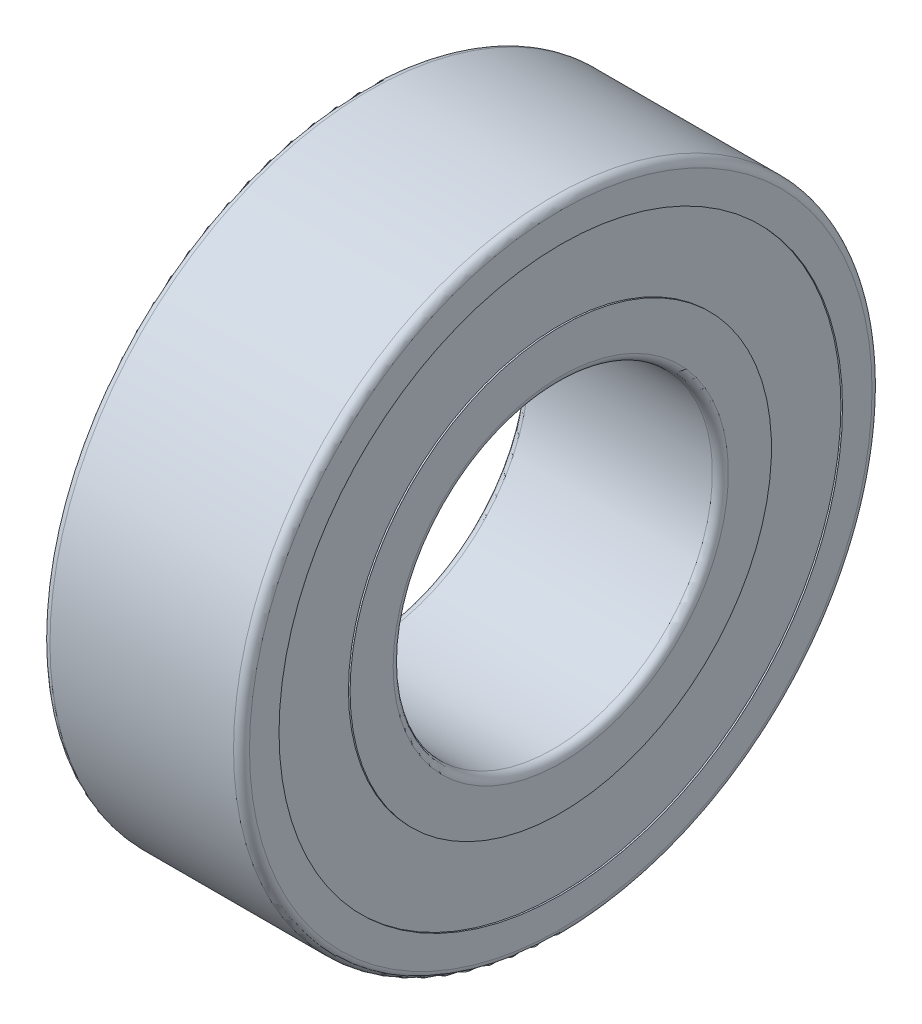
ISO-10303-21;
HEADER;
FILE_DESCRIPTION(('STEP AP214'),'2;1');
FILE_NAME('part.step','',(''),(''),'','','');
FILE_SCHEMA(('AUTOMOTIVE_DESIGN { 1 0 10303 214 1 1 1 1 }'));
ENDSEC;
DATA;
#1=APPLICATION_CONTEXT('core data for automotive mechanical design processes');
#2=APPLICATION_PROTOCOL_DEFINITION('international standard','automotive_design',2000,#1);
#3=PRODUCT_CONTEXT('',#1,'mechanical');
#4=PRODUCT('Part','Part','',(#3));
#5=PRODUCT_RELATED_PRODUCT_CATEGORY('part','',(#4));
#6=PRODUCT_DEFINITION_FORMATION('','',#4);
#7=PRODUCT_DEFINITION_CONTEXT('part definition',#1,'design');
#8=PRODUCT_DEFINITION('design','',#6,#7);
#9=PRODUCT_DEFINITION_SHAPE('','',#8);
#10=(LENGTH_UNIT() NAMED_UNIT(*) SI_UNIT(.MILLI.,.METRE.));
#11=(NAMED_UNIT(*) PLANE_ANGLE_UNIT() SI_UNIT($,.RADIAN.));
#12=(NAMED_UNIT(*) SI_UNIT($,.STERADIAN.) SOLID_ANGLE_UNIT());
#13=UNCERTAINTY_MEASURE_WITH_UNIT(LENGTH_MEASURE(1.E-05),#10,'distance_accuracy_value','');
#14=(GEOMETRIC_REPRESENTATION_CONTEXT(3) GLOBAL_UNCERTAINTY_ASSIGNED_CONTEXT((#13)) GLOBAL_UNIT_ASSIGNED_CONTEXT((#10,
#11,#12)) REPRESENTATION_CONTEXT('',''));
#15=CARTESIAN_POINT('',(0.,0.,0.));
#16=DIRECTION('',(0.,0.,1.));
#17=DIRECTION('',(1.,0.,0.));
#18=AXIS2_PLACEMENT_3D('',#15,#16,#17);
#19=CARTESIAN_POINT('',(0.200000000000014,0.,0.));
#20=DIRECTION('',(-1.,0.,0.));
#21=DIRECTION('',(0.,0.,1.));
#22=AXIS2_PLACEMENT_3D('',#19,#20,#21);
#23=TOROIDAL_SURFACE('',#22,4.20000000000001,0.200000000000014);
#24=CARTESIAN_POINT('',(0.199999999999999,0.,0.));
#25=DIRECTION('',(-1.,0.,0.));
#26=DIRECTION('',(0.,0.,1.));
#27=AXIS2_PLACEMENT_3D('',#24,#25,#26);
#28=CIRCLE('',#27,4.);
#29=CARTESIAN_POINT('',(0.199999999999999,0.,4.));
#30=VERTEX_POINT('',#29);
#31=EDGE_CURVE('E10',#30,#30,#28,.T.);
#32=ORIENTED_EDGE('',*,*,#31,.F.);
#33=EDGE_LOOP('',(#32));
#34=FACE_BOUND('',#33,.T.);
#35=CARTESIAN_POINT('',(0.,0.,0.));
#36=DIRECTION('',(-1.,0.,0.));
#37=DIRECTION('',(0.,0.,1.));
#38=AXIS2_PLACEMENT_3D('',#35,#36,#37);
#39=CIRCLE('',#38,4.2);
#40=CARTESIAN_POINT('',(0.,0.,4.2));
#41=VERTEX_POINT('',#40);
#42=EDGE_CURVE('E83',#41,#41,#39,.T.);
#43=ORIENTED_EDGE('',*,*,#42,.T.);
#44=EDGE_LOOP('',(#43));
#45=FACE_BOUND('',#44,.T.);
#46=ADVANCED_FACE('F31',(#34,#45),#23,.T.);
#47=CARTESIAN_POINT('',(50.,0.,0.));
#48=DIRECTION('',(-1.,0.,0.));
#49=DIRECTION('',(0.,0.,1.));
#50=AXIS2_PLACEMENT_3D('',#47,#48,#49);
#51=CYLINDRICAL_SURFACE('',#50,4.);
#52=CARTESIAN_POINT('',(4.8,0.,0.));
#53=DIRECTION('',(-1.,0.,0.));
#54=DIRECTION('',(0.,0.,1.));
#55=AXIS2_PLACEMENT_3D('',#52,#53,#54);
#56=CIRCLE('',#55,4.);
#57=CARTESIAN_POINT('',(4.8,0.,4.));
#58=VERTEX_POINT('',#57);
#59=EDGE_CURVE('E37',#58,#58,#56,.T.);
#60=ORIENTED_EDGE('',*,*,#59,.F.);
#61=EDGE_LOOP('',(#60));
#62=FACE_BOUND('',#61,.T.);
#63=ORIENTED_EDGE('',*,*,#31,.T.);
#64=EDGE_LOOP('',(#63));
#65=FACE_BOUND('',#64,.T.);
#66=ADVANCED_FACE('F168',(#62,#65),#51,.F.);
#67=CARTESIAN_POINT('',(4.79999999999997,0.,0.));
#68=DIRECTION('',(-1.,0.,0.));
#69=DIRECTION('',(0.,0.,1.));
#70=AXIS2_PLACEMENT_3D('',#67,#68,#69);
#71=TOROIDAL_SURFACE('',#70,4.20000000000003,0.200000000000031);
#72=CARTESIAN_POINT('',(5.,0.,0.));
#73=DIRECTION('',(-1.,0.,0.));
#74=DIRECTION('',(0.,0.,1.));
#75=AXIS2_PLACEMENT_3D('',#72,#73,#74);
#76=CIRCLE('',#75,4.2);
#77=CARTESIAN_POINT('',(5.,0.,4.2));
#78=VERTEX_POINT('',#77);
#79=EDGE_CURVE('E41',#78,#78,#76,.T.);
#80=ORIENTED_EDGE('',*,*,#79,.F.);
#81=EDGE_LOOP('',(#80));
#82=FACE_BOUND('',#81,.T.);
#83=ORIENTED_EDGE('',*,*,#59,.T.);
#84=EDGE_LOOP('',(#83));
#85=FACE_BOUND('',#84,.T.);
#86=ADVANCED_FACE('F163',(#82,#85),#71,.T.);
#87=CARTESIAN_POINT('',(5.,4.2,0.));
#88=DIRECTION('',(-1.,0.,0.));
#89=DIRECTION('',(0.,0.,1.));
#90=AXIS2_PLACEMENT_3D('',#87,#88,#89);
#91=PLANE('',#90);
#92=CARTESIAN_POINT('',(5.,0.,0.));
#93=DIRECTION('',(-1.,0.,0.));
#94=DIRECTION('',(0.,0.,1.));
#95=AXIS2_PLACEMENT_3D('',#92,#93,#94);
#96=CIRCLE('',#95,5.28);
#97=CARTESIAN_POINT('',(5.,0.,5.28));
#98=VERTEX_POINT('',#97);
#99=EDGE_CURVE('E45',#98,#98,#96,.T.);
#100=ORIENTED_EDGE('',*,*,#99,.F.);
#101=EDGE_LOOP('',(#100));
#102=FACE_BOUND('',#101,.T.);
#103=ORIENTED_EDGE('',*,*,#79,.T.);
#104=EDGE_LOOP('',(#103));
#105=FACE_BOUND('',#104,.T.);
#106=ADVANCED_FACE('F157',(#102,#105),#91,.F.);
#107=CARTESIAN_POINT('',(50.,0.,0.));
#108=DIRECTION('',(-1.,0.,0.));
#109=DIRECTION('',(0.,0.,1.));
#110=AXIS2_PLACEMENT_3D('',#107,#108,#109);
#111=CYLINDRICAL_SURFACE('',#110,5.28);
#112=CARTESIAN_POINT('',(4.96,0.,0.));
#113=DIRECTION('',(-1.,0.,0.));
#114=DIRECTION('',(0.,0.,1.));
#115=AXIS2_PLACEMENT_3D('',#112,#113,#114);
#116=CIRCLE('',#115,5.28);
#117=CARTESIAN_POINT('',(4.96,0.,5.28));
#118=VERTEX_POINT('',#117);
#119=EDGE_CURVE('E50',#118,#118,#116,.T.);
#120=ORIENTED_EDGE('',*,*,#119,.F.);
#121=EDGE_LOOP('',(#120));
#122=FACE_BOUND('',#121,.T.);
#123=ORIENTED_EDGE('',*,*,#99,.T.);
#124=EDGE_LOOP('',(#123));
#125=FACE_BOUND('',#124,.T.);
#126=ADVANCED_FACE('F151',(#122,#125),#111,.T.);
#127=CARTESIAN_POINT('',(4.96,5.28,0.));
#128=DIRECTION('',(-1.,0.,0.));
#129=DIRECTION('',(0.,0.,1.));
#130=AXIS2_PLACEMENT_3D('',#127,#128,#129);
#131=PLANE('',#130);
#132=CARTESIAN_POINT('',(4.96,0.,0.));
#133=DIRECTION('',(-1.,0.,0.));
#134=DIRECTION('',(0.,0.,1.));
#135=AXIS2_PLACEMENT_3D('',#132,#133,#134);
#136=CIRCLE('',#135,7.06);
#137=CARTESIAN_POINT('',(4.96,0.,7.06));
#138=VERTEX_POINT('',#137);
#139=EDGE_CURVE('E53',#138,#138,#136,.T.);
#140=ORIENTED_EDGE('',*,*,#139,.F.);
#141=EDGE_LOOP('',(#140));
#142=FACE_BOUND('',#141,.T.);
#143=ORIENTED_EDGE('',*,*,#119,.T.);
#144=EDGE_LOOP('',(#143));
#145=FACE_BOUND('',#144,.T.);
#146=ADVANCED_FACE('F145',(#142,#145),#131,.F.);
#147=CARTESIAN_POINT('',(50.,0.,0.));
#148=DIRECTION('',(-1.,0.,0.));
#149=DIRECTION('',(0.,0.,1.));
#150=AXIS2_PLACEMENT_3D('',#147,#148,#149);
#151=CYLINDRICAL_SURFACE('',#150,7.06);
#152=CARTESIAN_POINT('',(5.,0.,0.));
#153=DIRECTION('',(-1.,0.,0.));
#154=DIRECTION('',(0.,0.,1.));
#155=AXIS2_PLACEMENT_3D('',#152,#153,#154);
#156=CIRCLE('',#155,7.06);
#157=CARTESIAN_POINT('',(5.,0.,7.06));
#158=VERTEX_POINT('',#157);
#159=EDGE_CURVE('E56',#158,#158,#156,.T.);
#160=ORIENTED_EDGE('',*,*,#159,.F.);
#161=EDGE_LOOP('',(#160));
#162=FACE_BOUND('',#161,.T.);
#163=ORIENTED_EDGE('',*,*,#139,.T.);
#164=EDGE_LOOP('',(#163));
#165=FACE_BOUND('',#164,.T.);
#166=ADVANCED_FACE('F139',(#162,#165),#151,.F.);
#167=CARTESIAN_POINT('',(5.,7.06,0.));
#168=DIRECTION('',(-1.,0.,0.));
#169=DIRECTION('',(0.,0.,1.));
#170=AXIS2_PLACEMENT_3D('',#167,#168,#169);
#171=PLANE('',#170);
#172=CARTESIAN_POINT('',(5.,0.,0.));
#173=DIRECTION('',(-1.,0.,0.));
#174=DIRECTION('',(0.,0.,1.));
#175=AXIS2_PLACEMENT_3D('',#172,#173,#174);
#176=CIRCLE('',#175,7.8);
#177=CARTESIAN_POINT('',(5.,0.,7.8));
#178=VERTEX_POINT('',#177);
#179=EDGE_CURVE('E59',#178,#178,#176,.T.);
#180=ORIENTED_EDGE('',*,*,#179,.F.);
#181=EDGE_LOOP('',(#180));
#182=FACE_BOUND('',#181,.T.);
#183=ORIENTED_EDGE('',*,*,#159,.T.);
#184=EDGE_LOOP('',(#183));
#185=FACE_BOUND('',#184,.T.);
#186=ADVANCED_FACE('F133',(#182,#185),#171,.F.);
#187=CARTESIAN_POINT('',(4.79999999999997,0.,0.));
#188=DIRECTION('',(-1.,0.,0.));
#189=DIRECTION('',(0.,0.,1.));
#190=AXIS2_PLACEMENT_3D('',#187,#188,#189);
#191=TOROIDAL_SURFACE('',#190,7.79999999999997,0.200000000000031);
#192=CARTESIAN_POINT('',(4.8,0.,0.));
#193=DIRECTION('',(-1.,0.,0.));
#194=DIRECTION('',(0.,0.,1.));
#195=AXIS2_PLACEMENT_3D('',#192,#193,#194);
#196=CIRCLE('',#195,8.);
#197=CARTESIAN_POINT('',(4.8,0.,8.));
#198=VERTEX_POINT('',#197);
#199=EDGE_CURVE('E62',#198,#198,#196,.T.);
#200=ORIENTED_EDGE('',*,*,#199,.F.);
#201=EDGE_LOOP('',(#200));
#202=FACE_BOUND('',#201,.T.);
#203=ORIENTED_EDGE('',*,*,#179,.T.);
#204=EDGE_LOOP('',(#203));
#205=FACE_BOUND('',#204,.T.);
#206=ADVANCED_FACE('F127',(#202,#205),#191,.T.);
#207=CARTESIAN_POINT('',(50.,0.,0.));
#208=DIRECTION('',(-1.,0.,0.));
#209=DIRECTION('',(0.,0.,1.));
#210=AXIS2_PLACEMENT_3D('',#207,#208,#209);
#211=CYLINDRICAL_SURFACE('',#210,8.);
#212=CARTESIAN_POINT('',(0.199999999999999,0.,0.));
#213=DIRECTION('',(-1.,0.,0.));
#214=DIRECTION('',(0.,0.,1.));
#215=AXIS2_PLACEMENT_3D('',#212,#213,#214);
#216=CIRCLE('',#215,8.);
#217=CARTESIAN_POINT('',(0.199999999999999,0.,8.));
#218=VERTEX_POINT('',#217);
#219=EDGE_CURVE('E65',#218,#218,#216,.T.);
#220=ORIENTED_EDGE('',*,*,#219,.F.);
#221=EDGE_LOOP('',(#220));
#222=FACE_BOUND('',#221,.T.);
#223=ORIENTED_EDGE('',*,*,#199,.T.);
#224=EDGE_LOOP('',(#223));
#225=FACE_BOUND('',#224,.T.);
#226=ADVANCED_FACE('F121',(#222,#225),#211,.T.);
#227=CARTESIAN_POINT('',(0.200000000000016,0.,0.));
#228=DIRECTION('',(-1.,0.,0.));
#229=DIRECTION('',(0.,0.,1.));
#230=AXIS2_PLACEMENT_3D('',#227,#228,#229);
#231=TOROIDAL_SURFACE('',#230,7.79999999999998,0.200000000000016);
#232=CARTESIAN_POINT('',(0.,0.,0.));
#233=DIRECTION('',(-1.,0.,0.));
#234=DIRECTION('',(0.,0.,1.));
#235=AXIS2_PLACEMENT_3D('',#232,#233,#234);
#236=CIRCLE('',#235,7.8);
#237=CARTESIAN_POINT('',(0.,0.,7.8));
#238=VERTEX_POINT('',#237);
#239=EDGE_CURVE('E68',#238,#238,#236,.T.);
#240=ORIENTED_EDGE('',*,*,#239,.F.);
#241=EDGE_LOOP('',(#240));
#242=FACE_BOUND('',#241,.T.);
#243=ORIENTED_EDGE('',*,*,#219,.T.);
#244=EDGE_LOOP('',(#243));
#245=FACE_BOUND('',#244,.T.);
#246=ADVANCED_FACE('F115',(#242,#245),#231,.T.);
#247=CARTESIAN_POINT('',(0.,7.8,0.));
#248=DIRECTION('',(1.,0.,0.));
#249=DIRECTION('',(0.,0.,-1.));
#250=AXIS2_PLACEMENT_3D('',#247,#248,#249);
#251=PLANE('',#250);
#252=CARTESIAN_POINT('',(0.,0.,0.));
#253=DIRECTION('',(-1.,0.,0.));
#254=DIRECTION('',(0.,0.,1.));
#255=AXIS2_PLACEMENT_3D('',#252,#253,#254);
#256=CIRCLE('',#255,7.06);
#257=CARTESIAN_POINT('',(0.,0.,7.06));
#258=VERTEX_POINT('',#257);
#259=EDGE_CURVE('E71',#258,#258,#256,.T.);
#260=ORIENTED_EDGE('',*,*,#259,.F.);
#261=EDGE_LOOP('',(#260));
#262=FACE_BOUND('',#261,.T.);
#263=ORIENTED_EDGE('',*,*,#239,.T.);
#264=EDGE_LOOP('',(#263));
#265=FACE_BOUND('',#264,.T.);
#266=ADVANCED_FACE('F109',(#262,#265),#251,.F.);
#267=CARTESIAN_POINT('',(50.,0.,0.));
#268=DIRECTION('',(-1.,0.,0.));
#269=DIRECTION('',(0.,0.,1.));
#270=AXIS2_PLACEMENT_3D('',#267,#268,#269);
#271=CYLINDRICAL_SURFACE('',#270,7.06);
#272=CARTESIAN_POINT('',(0.0400000000000053,0.,0.));
#273=DIRECTION('',(-1.,0.,0.));
#274=DIRECTION('',(0.,0.,1.));
#275=AXIS2_PLACEMENT_3D('',#272,#273,#274);
#276=CIRCLE('',#275,7.06);
#277=CARTESIAN_POINT('',(0.0400000000000053,0.,7.06));
#278=VERTEX_POINT('',#277);
#279=EDGE_CURVE('E74',#278,#278,#276,.T.);
#280=ORIENTED_EDGE('',*,*,#279,.F.);
#281=EDGE_LOOP('',(#280));
#282=FACE_BOUND('',#281,.T.);
#283=ORIENTED_EDGE('',*,*,#259,.T.);
#284=EDGE_LOOP('',(#283));
#285=FACE_BOUND('',#284,.T.);
#286=ADVANCED_FACE('F103',(#282,#285),#271,.F.);
#287=CARTESIAN_POINT('',(0.040000000000006,7.06,0.));
#288=DIRECTION('',(1.,0.,0.));
#289=DIRECTION('',(0.,0.,-1.));
#290=AXIS2_PLACEMENT_3D('',#287,#288,#289);
#291=PLANE('',#290);
#292=CARTESIAN_POINT('',(0.0400000000000053,0.,0.));
#293=DIRECTION('',(-1.,0.,0.));
#294=DIRECTION('',(0.,0.,1.));
#295=AXIS2_PLACEMENT_3D('',#292,#293,#294);
#296=CIRCLE('',#295,5.28);
#297=CARTESIAN_POINT('',(0.0400000000000053,0.,5.28));
#298=VERTEX_POINT('',#297);
#299=EDGE_CURVE('E77',#298,#298,#296,.T.);
#300=ORIENTED_EDGE('',*,*,#299,.F.);
#301=EDGE_LOOP('',(#300));
#302=FACE_BOUND('',#301,.T.);
#303=ORIENTED_EDGE('',*,*,#279,.T.);
#304=EDGE_LOOP('',(#303));
#305=FACE_BOUND('',#304,.T.);
#306=ADVANCED_FACE('F97',(#302,#305),#291,.F.);
#307=CARTESIAN_POINT('',(50.,0.,0.));
#308=DIRECTION('',(-1.,0.,0.));
#309=DIRECTION('',(0.,0.,1.));
#310=AXIS2_PLACEMENT_3D('',#307,#308,#309);
#311=CYLINDRICAL_SURFACE('',#310,5.28);
#312=CARTESIAN_POINT('',(0.,0.,0.));
#313=DIRECTION('',(-1.,0.,0.));
#314=DIRECTION('',(0.,0.,1.));
#315=AXIS2_PLACEMENT_3D('',#312,#313,#314);
#316=CIRCLE('',#315,5.28);
#317=CARTESIAN_POINT('',(0.,0.,5.28));
#318=VERTEX_POINT('',#317);
#319=EDGE_CURVE('E80',#318,#318,#316,.T.);
#320=ORIENTED_EDGE('',*,*,#319,.F.);
#321=EDGE_LOOP('',(#320));
#322=FACE_BOUND('',#321,.T.);
#323=ORIENTED_EDGE('',*,*,#299,.T.);
#324=EDGE_LOOP('',(#323));
#325=FACE_BOUND('',#324,.T.);
#326=ADVANCED_FACE('F91',(#322,#325),#311,.T.);
#327=CARTESIAN_POINT('',(0.,5.28,0.));
#328=DIRECTION('',(1.,0.,0.));
#329=DIRECTION('',(0.,0.,-1.));
#330=AXIS2_PLACEMENT_3D('',#327,#328,#329);
#331=PLANE('',#330);
#332=ORIENTED_EDGE('',*,*,#42,.F.);
#333=EDGE_LOOP('',(#332));
#334=FACE_BOUND('',#333,.T.);
#335=ORIENTED_EDGE('',*,*,#319,.T.);
#336=EDGE_LOOP('',(#335));
#337=FACE_BOUND('',#336,.T.);
#338=ADVANCED_FACE('F88',(#334,#337),#331,.F.);
#339=CLOSED_SHELL('',(#46,#66,#86,#106,#126,#146,#166,#186,#206,#226,#246,#266,#286,#306,#326,#338));
#340=MANIFOLD_SOLID_BREP('B2',#339);
#341=ADVANCED_BREP_SHAPE_REPRESENTATION('',(#18,#340),#14);
#342=SHAPE_DEFINITION_REPRESENTATION(#9,#341);
ENDSEC;
END-ISO-10303-21;
